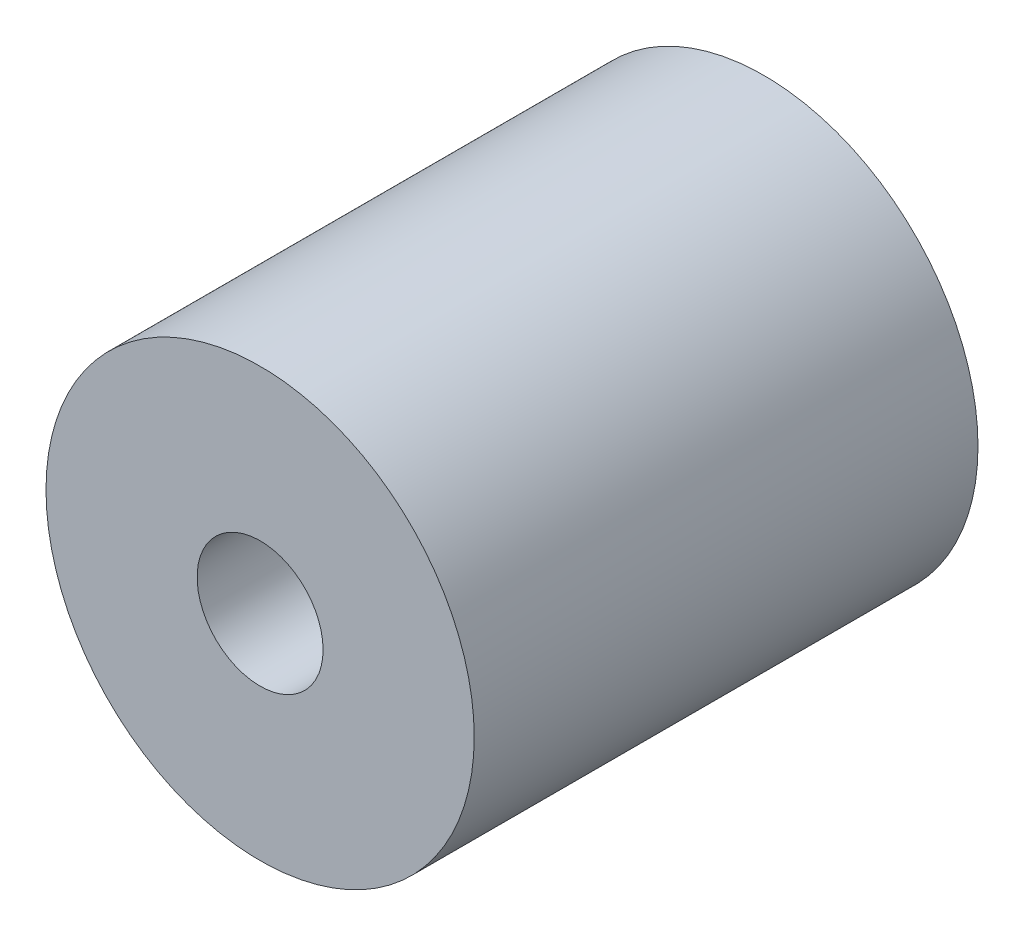
ISO-10303-21;
HEADER;
FILE_DESCRIPTION(('STEP AP214'),'2;1');
FILE_NAME('part.step','',(''),(''),'','','');
FILE_SCHEMA(('AUTOMOTIVE_DESIGN { 1 0 10303 214 1 1 1 1 }'));
ENDSEC;
DATA;
#1=APPLICATION_CONTEXT('core data for automotive mechanical design processes');
#2=APPLICATION_PROTOCOL_DEFINITION('international standard','automotive_design',2000,#1);
#3=PRODUCT_CONTEXT('',#1,'mechanical');
#4=PRODUCT('Part','Part','',(#3));
#5=PRODUCT_RELATED_PRODUCT_CATEGORY('part','',(#4));
#6=PRODUCT_DEFINITION_FORMATION('','',#4);
#7=PRODUCT_DEFINITION_CONTEXT('part definition',#1,'design');
#8=PRODUCT_DEFINITION('design','',#6,#7);
#9=PRODUCT_DEFINITION_SHAPE('','',#8);
#10=(LENGTH_UNIT() NAMED_UNIT(*) SI_UNIT(.MILLI.,.METRE.));
#11=(NAMED_UNIT(*) PLANE_ANGLE_UNIT() SI_UNIT($,.RADIAN.));
#12=(NAMED_UNIT(*) SI_UNIT($,.STERADIAN.) SOLID_ANGLE_UNIT());
#13=UNCERTAINTY_MEASURE_WITH_UNIT(LENGTH_MEASURE(1.E-05),#10,'distance_accuracy_value','');
#14=(GEOMETRIC_REPRESENTATION_CONTEXT(3) GLOBAL_UNCERTAINTY_ASSIGNED_CONTEXT((#13)) GLOBAL_UNIT_ASSIGNED_CONTEXT((#10,
#11,#12)) REPRESENTATION_CONTEXT('',''));
#15=CARTESIAN_POINT('',(0.,0.,0.));
#16=DIRECTION('',(0.,0.,1.));
#17=DIRECTION('',(1.,0.,0.));
#18=AXIS2_PLACEMENT_3D('',#15,#16,#17);
#19=CARTESIAN_POINT('',(0.,0.,20.));
#20=DIRECTION('',(0.,0.,-1.));
#21=DIRECTION('',(-1.,0.,0.));
#22=AXIS2_PLACEMENT_3D('',#19,#20,#21);
#23=CYLINDRICAL_SURFACE('',#22,8.5);
#24=CARTESIAN_POINT('',(0.,0.,20.));
#25=DIRECTION('',(0.,0.,1.));
#26=DIRECTION('',(1.,0.,0.));
#27=AXIS2_PLACEMENT_3D('',#24,#25,#26);
#28=CIRCLE('',#27,8.5);
#29=CARTESIAN_POINT('',(8.5,0.,20.));
#30=VERTEX_POINT('',#29);
#31=EDGE_CURVE('E10',#30,#30,#28,.T.);
#32=ORIENTED_EDGE('',*,*,#31,.F.);
#33=EDGE_LOOP('',(#32));
#34=FACE_BOUND('',#33,.T.);
#35=CARTESIAN_POINT('',(0.,0.,0.));
#36=DIRECTION('',(0.,0.,1.));
#37=DIRECTION('',(1.,0.,0.));
#38=AXIS2_PLACEMENT_3D('',#35,#36,#37);
#39=CIRCLE('',#38,8.5);
#40=CARTESIAN_POINT('',(8.5,0.,0.));
#41=VERTEX_POINT('',#40);
#42=EDGE_CURVE('E36',#41,#41,#39,.T.);
#43=ORIENTED_EDGE('',*,*,#42,.T.);
#44=EDGE_LOOP('',(#43));
#45=FACE_BOUND('',#44,.T.);
#46=ADVANCED_FACE('F33',(#34,#45),#23,.T.);
#47=CARTESIAN_POINT('',(0.,0.,20.));
#48=DIRECTION('',(0.,0.,1.));
#49=DIRECTION('',(1.,0.,0.));
#50=AXIS2_PLACEMENT_3D('',#47,#48,#49);
#51=PLANE('',#50);
#52=CARTESIAN_POINT('',(0.,0.,20.));
#53=DIRECTION('',(0.,0.,1.));
#54=DIRECTION('',(1.,0.,0.));
#55=AXIS2_PLACEMENT_3D('',#52,#53,#54);
#56=CIRCLE('',#55,2.5);
#57=CARTESIAN_POINT('',(2.5,0.,20.));
#58=VERTEX_POINT('',#57);
#59=EDGE_CURVE('E45',#58,#58,#56,.T.);
#60=ORIENTED_EDGE('',*,*,#59,.F.);
#61=EDGE_LOOP('',(#60));
#62=FACE_BOUND('',#61,.T.);
#63=ORIENTED_EDGE('',*,*,#31,.T.);
#64=EDGE_LOOP('',(#63));
#65=FACE_BOUND('',#64,.T.);
#66=ADVANCED_FACE('F60',(#62,#65),#51,.T.);
#67=CARTESIAN_POINT('',(0.,0.,0.));
#68=DIRECTION('',(0.,0.,1.));
#69=DIRECTION('',(1.,0.,0.));
#70=AXIS2_PLACEMENT_3D('',#67,#68,#69);
#71=PLANE('',#70);
#72=CARTESIAN_POINT('',(0.,0.,0.));
#73=DIRECTION('',(0.,0.,1.));
#74=DIRECTION('',(1.,0.,0.));
#75=AXIS2_PLACEMENT_3D('',#72,#73,#74);
#76=CIRCLE('',#75,2.5);
#77=CARTESIAN_POINT('',(2.5,0.,0.));
#78=VERTEX_POINT('',#77);
#79=EDGE_CURVE('E43',#78,#78,#76,.T.);
#80=ORIENTED_EDGE('',*,*,#79,.T.);
#81=EDGE_LOOP('',(#80));
#82=FACE_BOUND('',#81,.T.);
#83=ORIENTED_EDGE('',*,*,#42,.F.);
#84=EDGE_LOOP('',(#83));
#85=FACE_BOUND('',#84,.T.);
#86=ADVANCED_FACE('F51',(#82,#85),#71,.F.);
#87=CARTESIAN_POINT('',(0.,0.,0.));
#88=DIRECTION('',(0.,0.,1.));
#89=DIRECTION('',(1.,0.,0.));
#90=AXIS2_PLACEMENT_3D('',#87,#88,#89);
#91=CYLINDRICAL_SURFACE('',#90,2.5);
#92=ORIENTED_EDGE('',*,*,#79,.F.);
#93=EDGE_LOOP('',(#92));
#94=FACE_BOUND('',#93,.T.);
#95=ORIENTED_EDGE('',*,*,#59,.T.);
#96=EDGE_LOOP('',(#95));
#97=FACE_BOUND('',#96,.T.);
#98=ADVANCED_FACE('F54',(#94,#97),#91,.F.);
#99=CLOSED_SHELL('',(#46,#66,#86,#98));
#100=MANIFOLD_SOLID_BREP('B2',#99);
#101=ADVANCED_BREP_SHAPE_REPRESENTATION('',(#18,#100),#14);
#102=SHAPE_DEFINITION_REPRESENTATION(#9,#101);
ENDSEC;
END-ISO-10303-21;
